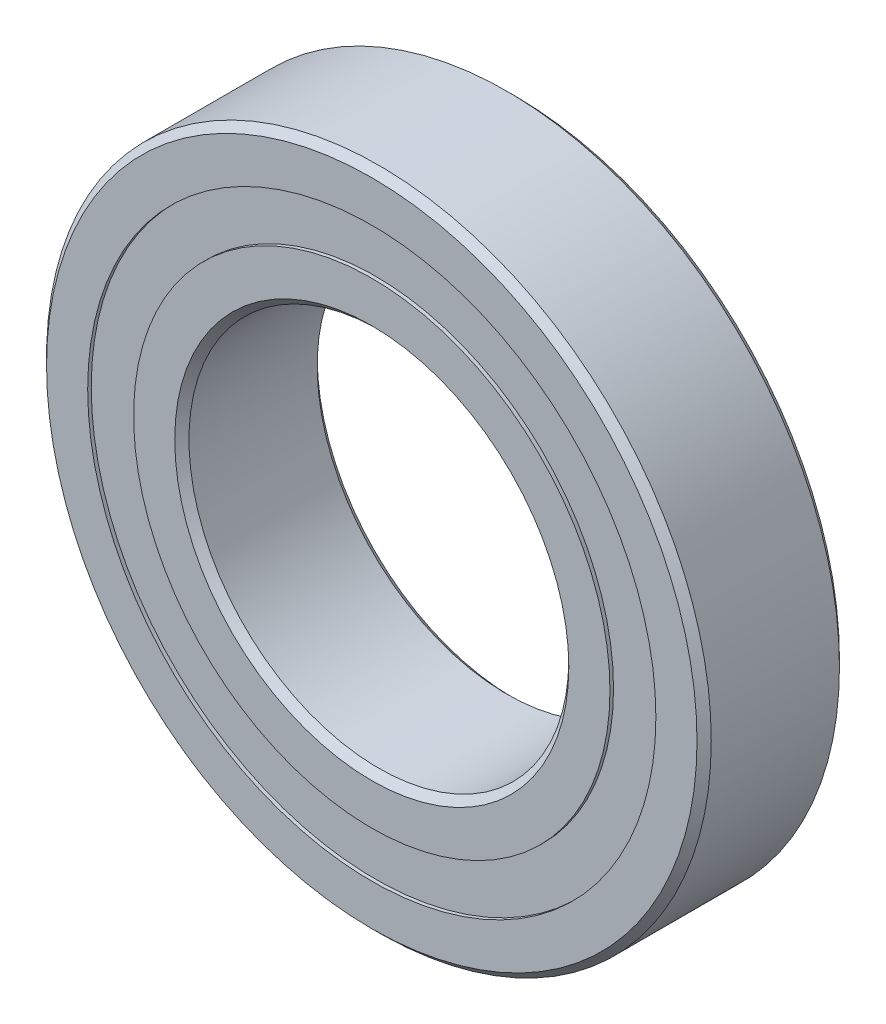
ISO-10303-21;
HEADER;
FILE_DESCRIPTION(('STEP AP214'),'2;1');
FILE_NAME('part.step','',(''),(''),'','','');
FILE_SCHEMA(('AUTOMOTIVE_DESIGN { 1 0 10303 214 1 1 1 1 }'));
ENDSEC;
DATA;
#1=APPLICATION_CONTEXT('core data for automotive mechanical design processes');
#2=APPLICATION_PROTOCOL_DEFINITION('international standard','automotive_design',2000,#1);
#3=PRODUCT_CONTEXT('',#1,'mechanical');
#4=PRODUCT('Part','Part','',(#3));
#5=PRODUCT_RELATED_PRODUCT_CATEGORY('part','',(#4));
#6=PRODUCT_DEFINITION_FORMATION('','',#4);
#7=PRODUCT_DEFINITION_CONTEXT('part definition',#1,'design');
#8=PRODUCT_DEFINITION('design','',#6,#7);
#9=PRODUCT_DEFINITION_SHAPE('','',#8);
#10=(LENGTH_UNIT() NAMED_UNIT(*) SI_UNIT(.MILLI.,.METRE.));
#11=(NAMED_UNIT(*) PLANE_ANGLE_UNIT() SI_UNIT($,.RADIAN.));
#12=(NAMED_UNIT(*) SI_UNIT($,.STERADIAN.) SOLID_ANGLE_UNIT());
#13=UNCERTAINTY_MEASURE_WITH_UNIT(LENGTH_MEASURE(1.E-05),#10,'distance_accuracy_value','');
#14=(GEOMETRIC_REPRESENTATION_CONTEXT(3) GLOBAL_UNCERTAINTY_ASSIGNED_CONTEXT((#13)) GLOBAL_UNIT_ASSIGNED_CONTEXT((#10,
#11,#12)) REPRESENTATION_CONTEXT('',''));
#15=CARTESIAN_POINT('',(0.,0.,0.));
#16=DIRECTION('',(0.,0.,1.));
#17=DIRECTION('',(1.,0.,0.));
#18=AXIS2_PLACEMENT_3D('',#15,#16,#17);
#19=CARTESIAN_POINT('',(0.,28.4964972527473,-6.7865625));
#20=DIRECTION('',(0.,0.,1.));
#21=DIRECTION('',(1.,0.,0.));
#22=AXIS2_PLACEMENT_3D('',#19,#20,#21);
#23=PLANE('',#22);
#24=CARTESIAN_POINT('',(0.,0.,-6.7865625));
#25=DIRECTION('',(0.,0.,1.));
#26=DIRECTION('',(1.,0.,0.));
#27=AXIS2_PLACEMENT_3D('',#24,#25,#26);
#28=CIRCLE('',#27,28.4964972527473);
#29=CARTESIAN_POINT('',(28.4964972527473,0.,-6.7865625));
#30=VERTEX_POINT('',#29);
#31=EDGE_CURVE('E61',#30,#30,#28,.T.);
#32=ORIENTED_EDGE('',*,*,#31,.F.);
#33=EDGE_LOOP('',(#32));
#34=FACE_BOUND('',#33,.T.);
#35=CARTESIAN_POINT('',(0.,0.,-6.7865625));
#36=DIRECTION('',(0.,0.,1.));
#37=DIRECTION('',(1.,0.,0.));
#38=AXIS2_PLACEMENT_3D('',#35,#36,#37);
#39=CIRCLE('',#38,23.8910027472527);
#40=CARTESIAN_POINT('',(23.8910027472527,0.,-6.7865625));
#41=VERTEX_POINT('',#40);
#42=EDGE_CURVE('E11',#41,#41,#39,.T.);
#43=ORIENTED_EDGE('',*,*,#42,.T.);
#44=EDGE_LOOP('',(#43));
#45=FACE_BOUND('',#44,.T.);
#46=ADVANCED_FACE('F47',(#34,#45),#23,.F.);
#47=CARTESIAN_POINT('',(0.,0.,7.14375));
#48=DIRECTION('',(0.,0.,1.));
#49=DIRECTION('',(1.,0.,0.));
#50=AXIS2_PLACEMENT_3D('',#47,#48,#49);
#51=CYLINDRICAL_SURFACE('',#50,23.8910027472527);
#52=ORIENTED_EDGE('',*,*,#42,.F.);
#53=EDGE_LOOP('',(#52));
#54=FACE_BOUND('',#53,.T.);
#55=CARTESIAN_POINT('',(0.,0.,-3.92215118398501));
#56=DIRECTION('',(0.,0.,1.));
#57=DIRECTION('',(1.,0.,0.));
#58=AXIS2_PLACEMENT_3D('',#55,#56,#57);
#59=CIRCLE('',#58,23.8910027472527);
#60=CARTESIAN_POINT('',(23.8910027472527,0.,-3.92215118398501));
#61=VERTEX_POINT('',#60);
#62=EDGE_CURVE('E53',#61,#61,#59,.T.);
#63=ORIENTED_EDGE('',*,*,#62,.T.);
#64=EDGE_LOOP('',(#63));
#65=FACE_BOUND('',#64,.T.);
#66=ADVANCED_FACE('F70',(#54,#65),#51,.F.);
#67=CARTESIAN_POINT('',(0.,28.4964972527473,-3.92215118398501));
#68=DIRECTION('',(0.,0.,-1.));
#69=DIRECTION('',(-1.,0.,0.));
#70=AXIS2_PLACEMENT_3D('',#67,#68,#69);
#71=PLANE('',#70);
#72=ORIENTED_EDGE('',*,*,#62,.F.);
#73=EDGE_LOOP('',(#72));
#74=FACE_BOUND('',#73,.T.);
#75=CARTESIAN_POINT('',(0.,0.,-3.92215118398501));
#76=DIRECTION('',(0.,0.,1.));
#77=DIRECTION('',(1.,0.,0.));
#78=AXIS2_PLACEMENT_3D('',#75,#76,#77);
#79=CIRCLE('',#78,28.4964972527473);
#80=CARTESIAN_POINT('',(28.4964972527473,0.,-3.92215118398501));
#81=VERTEX_POINT('',#80);
#82=EDGE_CURVE('E57',#81,#81,#79,.T.);
#83=ORIENTED_EDGE('',*,*,#82,.T.);
#84=EDGE_LOOP('',(#83));
#85=FACE_BOUND('',#84,.T.);
#86=ADVANCED_FACE('F74',(#74,#85),#71,.F.);
#87=CARTESIAN_POINT('',(0.,0.,7.14375));
#88=DIRECTION('',(0.,0.,1.));
#89=DIRECTION('',(1.,0.,0.));
#90=AXIS2_PLACEMENT_3D('',#87,#88,#89);
#91=CYLINDRICAL_SURFACE('',#90,28.4964972527473);
#92=ORIENTED_EDGE('',*,*,#82,.F.);
#93=EDGE_LOOP('',(#92));
#94=FACE_BOUND('',#93,.T.);
#95=ORIENTED_EDGE('',*,*,#31,.T.);
#96=EDGE_LOOP('',(#95));
#97=FACE_BOUND('',#96,.T.);
#98=ADVANCED_FACE('F67',(#94,#97),#91,.T.);
#99=CLOSED_SHELL('',(#46,#66,#86,#98));
#100=MANIFOLD_SOLID_BREP('B2',#99);
#101=CARTESIAN_POINT('',(0.,28.4964972527473,6.7865625));
#102=DIRECTION('',(0.,0.,-1.));
#103=DIRECTION('',(-1.,0.,0.));
#104=AXIS2_PLACEMENT_3D('',#101,#102,#103);
#105=PLANE('',#104);
#106=CARTESIAN_POINT('',(0.,0.,6.7865625));
#107=DIRECTION('',(0.,0.,1.));
#108=DIRECTION('',(1.,0.,0.));
#109=AXIS2_PLACEMENT_3D('',#106,#107,#108);
#110=CIRCLE('',#109,23.8910027472527);
#111=CARTESIAN_POINT('',(23.8910027472527,0.,6.7865625));
#112=VERTEX_POINT('',#111);
#113=EDGE_CURVE('E46',#112,#112,#110,.T.);
#114=ORIENTED_EDGE('',*,*,#113,.F.);
#115=EDGE_LOOP('',(#114));
#116=FACE_BOUND('',#115,.T.);
#117=CARTESIAN_POINT('',(0.,0.,6.7865625));
#118=DIRECTION('',(0.,0.,1.));
#119=DIRECTION('',(1.,0.,0.));
#120=AXIS2_PLACEMENT_3D('',#117,#118,#119);
#121=CIRCLE('',#120,28.4964972527473);
#122=CARTESIAN_POINT('',(28.4964972527473,0.,6.7865625));
#123=VERTEX_POINT('',#122);
#124=EDGE_CURVE('E128',#123,#123,#121,.T.);
#125=ORIENTED_EDGE('',*,*,#124,.T.);
#126=EDGE_LOOP('',(#125));
#127=FACE_BOUND('',#126,.T.);
#128=ADVANCED_FACE('F114',(#116,#127),#105,.F.);
#129=CARTESIAN_POINT('',(0.,0.,7.14375));
#130=DIRECTION('',(0.,0.,1.));
#131=DIRECTION('',(1.,0.,0.));
#132=AXIS2_PLACEMENT_3D('',#129,#130,#131);
#133=CYLINDRICAL_SURFACE('',#132,23.8910027472527);
#134=CARTESIAN_POINT('',(0.,0.,3.92215118398501));
#135=DIRECTION('',(0.,0.,1.));
#136=DIRECTION('',(1.,0.,0.));
#137=AXIS2_PLACEMENT_3D('',#134,#135,#136);
#138=CIRCLE('',#137,23.8910027472527);
#139=CARTESIAN_POINT('',(23.8910027472527,0.,3.92215118398501));
#140=VERTEX_POINT('',#139);
#141=EDGE_CURVE('E120',#140,#140,#138,.T.);
#142=ORIENTED_EDGE('',*,*,#141,.F.);
#143=EDGE_LOOP('',(#142));
#144=FACE_BOUND('',#143,.T.);
#145=ORIENTED_EDGE('',*,*,#113,.T.);
#146=EDGE_LOOP('',(#145));
#147=FACE_BOUND('',#146,.T.);
#148=ADVANCED_FACE('F143',(#144,#147),#133,.F.);
#149=CARTESIAN_POINT('',(0.,28.4964972527473,3.92215118398501));
#150=DIRECTION('',(0.,0.,1.));
#151=DIRECTION('',(1.,0.,0.));
#152=AXIS2_PLACEMENT_3D('',#149,#150,#151);
#153=PLANE('',#152);
#154=CARTESIAN_POINT('',(0.,0.,3.92215118398501));
#155=DIRECTION('',(0.,0.,1.));
#156=DIRECTION('',(1.,0.,0.));
#157=AXIS2_PLACEMENT_3D('',#154,#155,#156);
#158=CIRCLE('',#157,28.4964972527473);
#159=CARTESIAN_POINT('',(28.4964972527473,0.,3.92215118398501));
#160=VERTEX_POINT('',#159);
#161=EDGE_CURVE('E124',#160,#160,#158,.T.);
#162=ORIENTED_EDGE('',*,*,#161,.F.);
#163=EDGE_LOOP('',(#162));
#164=FACE_BOUND('',#163,.T.);
#165=ORIENTED_EDGE('',*,*,#141,.T.);
#166=EDGE_LOOP('',(#165));
#167=FACE_BOUND('',#166,.T.);
#168=ADVANCED_FACE('F138',(#164,#167),#153,.F.);
#169=CARTESIAN_POINT('',(0.,0.,7.14375));
#170=DIRECTION('',(0.,0.,1.));
#171=DIRECTION('',(1.,0.,0.));
#172=AXIS2_PLACEMENT_3D('',#169,#170,#171);
#173=CYLINDRICAL_SURFACE('',#172,28.4964972527473);
#174=ORIENTED_EDGE('',*,*,#124,.F.);
#175=EDGE_LOOP('',(#174));
#176=FACE_BOUND('',#175,.T.);
#177=ORIENTED_EDGE('',*,*,#161,.T.);
#178=EDGE_LOOP('',(#177));
#179=FACE_BOUND('',#178,.T.);
#180=ADVANCED_FACE('F135',(#176,#179),#173,.T.);
#181=CLOSED_SHELL('',(#128,#148,#168,#180));
#182=MANIFOLD_SOLID_BREP('B6',#181);
#183=CARTESIAN_POINT('',(-13.0968749999997,22.6844529203788,0.));
#184=DIRECTION('',(0.,0.,1.));
#185=DIRECTION('',(-0.499999999999989,0.866025403784445,0.));
#186=AXIS2_PLACEMENT_3D('',#183,#184,#185);
#187=SPHERICAL_SURFACE('',#186,3.92215118398501);
#188=CARTESIAN_POINT('',(-13.0968749999997,22.6844529203788,3.92215118398501));
#189=VERTEX_POINT('',#188);
#190=VERTEX_LOOP('',#189);
#191=FACE_BOUND('',#190,.T.);
#192=ADVANCED_FACE('F181',(#191),#187,.T.);
#193=CLOSED_SHELL('',(#192));
#194=MANIFOLD_SOLID_BREP('B41',#193);
#195=CARTESIAN_POINT('',(-22.6844529203785,13.0968750000003,0.));
#196=DIRECTION('',(0.,0.,1.));
#197=DIRECTION('',(-0.866025403784433,0.50000000000001,0.));
#198=AXIS2_PLACEMENT_3D('',#195,#196,#197);
#199=SPHERICAL_SURFACE('',#198,3.92215118398501);
#200=CARTESIAN_POINT('',(-22.6844529203785,13.0968750000003,3.92215118398501));
#201=VERTEX_POINT('',#200);
#202=VERTEX_LOOP('',#201);
#203=FACE_BOUND('',#202,.T.);
#204=ADVANCED_FACE('F201',(#203),#199,.T.);
#205=CLOSED_SHELL('',(#204));
#206=MANIFOLD_SOLID_BREP('B110',#205);
#207=CARTESIAN_POINT('',(-26.19375,2.74364967957967E-13,0.));
#208=DIRECTION('',(0.,0.,1.));
#209=DIRECTION('',(-1.,0.,0.));
#210=AXIS2_PLACEMENT_3D('',#207,#208,#209);
#211=SPHERICAL_SURFACE('',#210,3.92215118398501);
#212=CARTESIAN_POINT('',(-26.19375,2.74364967957967E-13,3.92215118398501));
#213=VERTEX_POINT('',#212);
#214=VERTEX_LOOP('',#213);
#215=FACE_BOUND('',#214,.T.);
#216=ADVANCED_FACE('F221',(#215),#211,.T.);
#217=CLOSED_SHELL('',(#216));
#218=MANIFOLD_SOLID_BREP('B177',#217);
#219=CARTESIAN_POINT('',(-22.6844529203788,-13.0968749999998,0.));
#220=DIRECTION('',(0.,0.,1.));
#221=DIRECTION('',(-0.866025403784443,-0.499999999999992,0.));
#222=AXIS2_PLACEMENT_3D('',#219,#220,#221);
#223=SPHERICAL_SURFACE('',#222,3.92215118398501);
#224=CARTESIAN_POINT('',(-22.6844529203788,-13.0968749999998,3.92215118398501));
#225=VERTEX_POINT('',#224);
#226=VERTEX_LOOP('',#225);
#227=FACE_BOUND('',#226,.T.);
#228=ADVANCED_FACE('F241',(#227),#223,.T.);
#229=CLOSED_SHELL('',(#228));
#230=MANIFOLD_SOLID_BREP('B197',#229);
#231=CARTESIAN_POINT('',(-13.0968750000002,-22.6844529203785,0.));
#232=DIRECTION('',(0.,0.,1.));
#233=DIRECTION('',(-0.500000000000007,-0.866025403784435,0.));
#234=AXIS2_PLACEMENT_3D('',#231,#232,#233);
#235=SPHERICAL_SURFACE('',#234,3.92215118398501);
#236=CARTESIAN_POINT('',(-13.0968750000002,-22.6844529203785,3.92215118398501));
#237=VERTEX_POINT('',#236);
#238=VERTEX_LOOP('',#237);
#239=FACE_BOUND('',#238,.T.);
#240=ADVANCED_FACE('F261',(#239),#235,.T.);
#241=CLOSED_SHELL('',(#240));
#242=MANIFOLD_SOLID_BREP('B217',#241);
#243=CARTESIAN_POINT('',(-1.82909978638645E-13,-26.19375,0.));
#244=DIRECTION('',(0.,0.,1.));
#245=DIRECTION('',(0.,-1.,0.));
#246=AXIS2_PLACEMENT_3D('',#243,#244,#245);
#247=SPHERICAL_SURFACE('',#246,3.92215118398501);
#248=CARTESIAN_POINT('',(-1.82909978638645E-13,-26.19375,3.92215118398501));
#249=VERTEX_POINT('',#248);
#250=VERTEX_LOOP('',#249);
#251=FACE_BOUND('',#250,.T.);
#252=ADVANCED_FACE('F281',(#251),#247,.T.);
#253=CLOSED_SHELL('',(#252));
#254=MANIFOLD_SOLID_BREP('B237',#253);
#255=CARTESIAN_POINT('',(13.0968749999999,-22.6844529203787,0.));
#256=DIRECTION('',(0.,0.,1.));
#257=DIRECTION('',(0.499999999999995,-0.866025403784442,0.));
#258=AXIS2_PLACEMENT_3D('',#255,#256,#257);
#259=SPHERICAL_SURFACE('',#258,3.92215118398501);
#260=CARTESIAN_POINT('',(13.0968749999999,-22.6844529203787,3.92215118398501));
#261=VERTEX_POINT('',#260);
#262=VERTEX_LOOP('',#261);
#263=FACE_BOUND('',#262,.T.);
#264=ADVANCED_FACE('F301',(#263),#259,.T.);
#265=CLOSED_SHELL('',(#264));
#266=MANIFOLD_SOLID_BREP('B257',#265);
#267=CARTESIAN_POINT('',(22.6844529203786,-13.0968750000001,0.));
#268=DIRECTION('',(0.,0.,1.));
#269=DIRECTION('',(0.866025403784436,-0.500000000000004,0.));
#270=AXIS2_PLACEMENT_3D('',#267,#268,#269);
#271=SPHERICAL_SURFACE('',#270,3.92215118398501);
#272=CARTESIAN_POINT('',(22.6844529203786,-13.0968750000001,3.92215118398501));
#273=VERTEX_POINT('',#272);
#274=VERTEX_LOOP('',#273);
#275=FACE_BOUND('',#274,.T.);
#276=ADVANCED_FACE('F321',(#275),#271,.T.);
#277=CLOSED_SHELL('',(#276));
#278=MANIFOLD_SOLID_BREP('B277',#277);
#279=CARTESIAN_POINT('',(26.19375,0.,0.));
#280=DIRECTION('',(0.,0.,1.));
#281=DIRECTION('',(1.,0.,0.));
#282=AXIS2_PLACEMENT_3D('',#279,#280,#281);
#283=SPHERICAL_SURFACE('',#282,3.92215118398501);
#284=CARTESIAN_POINT('',(26.19375,0.,3.92215118398501));
#285=VERTEX_POINT('',#284);
#286=VERTEX_LOOP('',#285);
#287=FACE_BOUND('',#286,.T.);
#288=ADVANCED_FACE('F341',(#287),#283,.T.);
#289=CLOSED_SHELL('',(#288));
#290=MANIFOLD_SOLID_BREP('B297',#289);
#291=CARTESIAN_POINT('',(22.6844529203787,13.0968749999999,0.));
#292=DIRECTION('',(0.,0.,1.));
#293=DIRECTION('',(0.86602540378444,0.499999999999998,0.));
#294=AXIS2_PLACEMENT_3D('',#291,#292,#293);
#295=SPHERICAL_SURFACE('',#294,3.92215118398501);
#296=CARTESIAN_POINT('',(22.6844529203787,13.0968749999999,3.92215118398501));
#297=VERTEX_POINT('',#296);
#298=VERTEX_LOOP('',#297);
#299=FACE_BOUND('',#298,.T.);
#300=ADVANCED_FACE('F361',(#299),#295,.T.);
#301=CLOSED_SHELL('',(#300));
#302=MANIFOLD_SOLID_BREP('B317',#301);
#303=CARTESIAN_POINT('',(13.096875,22.6844529203786,0.));
#304=DIRECTION('',(0.,0.,1.));
#305=DIRECTION('',(0.500000000000001,0.866025403784438,0.));
#306=AXIS2_PLACEMENT_3D('',#303,#304,#305);
#307=SPHERICAL_SURFACE('',#306,3.92215118398501);
#308=CARTESIAN_POINT('',(13.096875,22.6844529203786,3.92215118398501));
#309=VERTEX_POINT('',#308);
#310=VERTEX_LOOP('',#309);
#311=FACE_BOUND('',#310,.T.);
#312=ADVANCED_FACE('F381',(#311),#307,.T.);
#313=CLOSED_SHELL('',(#312));
#314=MANIFOLD_SOLID_BREP('B337',#313);
#315=CARTESIAN_POINT('',(0.,26.19375,0.));
#316=DIRECTION('',(0.,0.,1.));
#317=DIRECTION('',(0.,1.,0.));
#318=AXIS2_PLACEMENT_3D('',#315,#316,#317);
#319=SPHERICAL_SURFACE('',#318,3.92215118398501);
#320=CARTESIAN_POINT('',(0.,26.19375,3.92215118398501));
#321=VERTEX_POINT('',#320);
#322=VERTEX_LOOP('',#321);
#323=FACE_BOUND('',#322,.T.);
#324=ADVANCED_FACE('F403',(#323),#319,.T.);
#325=CLOSED_SHELL('',(#324));
#326=MANIFOLD_SOLID_BREP('B357',#325);
#327=CARTESIAN_POINT('',(0.,23.8910027472527,7.14375));
#328=DIRECTION('',(0.,0.,-1.));
#329=DIRECTION('',(-1.,0.,0.));
#330=AXIS2_PLACEMENT_3D('',#327,#328,#329);
#331=PLANE('',#330);
#332=CARTESIAN_POINT('',(0.,0.,7.14375));
#333=DIRECTION('',(0.,0.,1.));
#334=DIRECTION('',(1.,0.,0.));
#335=AXIS2_PLACEMENT_3D('',#332,#333,#334);
#336=CIRCLE('',#335,19.764375);
#337=CARTESIAN_POINT('',(19.764375,0.,7.14375));
#338=VERTEX_POINT('',#337);
#339=EDGE_CURVE('E450',#338,#338,#336,.T.);
#340=ORIENTED_EDGE('',*,*,#339,.F.);
#341=EDGE_LOOP('',(#340));
#342=FACE_BOUND('',#341,.T.);
#343=CARTESIAN_POINT('',(0.,0.,7.14375));
#344=DIRECTION('',(0.,0.,1.));
#345=DIRECTION('',(1.,0.,0.));
#346=AXIS2_PLACEMENT_3D('',#343,#344,#345);
#347=CIRCLE('',#346,23.8910027472527);
#348=CARTESIAN_POINT('',(23.8910027472527,0.,7.14375));
#349=VERTEX_POINT('',#348);
#350=EDGE_CURVE('E402',#349,#349,#347,.T.);
#351=ORIENTED_EDGE('',*,*,#350,.T.);
#352=EDGE_LOOP('',(#351));
#353=FACE_BOUND('',#352,.T.);
#354=ADVANCED_FACE('F422',(#342,#353),#331,.F.);
#355=CARTESIAN_POINT('',(0.,0.,7.14375));
#356=DIRECTION('',(0.,0.,1.));
#357=DIRECTION('',(1.,0.,0.));
#358=AXIS2_PLACEMENT_3D('',#355,#356,#357);
#359=CYLINDRICAL_SURFACE('',#358,23.8910027472527);
#360=ORIENTED_EDGE('',*,*,#350,.F.);
#361=EDGE_LOOP('',(#360));
#362=FACE_BOUND('',#361,.T.);
#363=CARTESIAN_POINT('',(0.,0.,3.175));
#364=DIRECTION('',(0.,0.,1.));
#365=DIRECTION('',(1.,0.,0.));
#366=AXIS2_PLACEMENT_3D('',#363,#364,#365);
#367=CIRCLE('',#366,23.8910027472527);
#368=CARTESIAN_POINT('',(23.8910027472527,0.,3.175));
#369=VERTEX_POINT('',#368);
#370=EDGE_CURVE('E428',#369,#369,#367,.T.);
#371=ORIENTED_EDGE('',*,*,#370,.T.);
#372=EDGE_LOOP('',(#371));
#373=FACE_BOUND('',#372,.T.);
#374=ADVANCED_FACE('F457',(#362,#373),#359,.T.);
#375=CARTESIAN_POINT('',(0.,0.,0.));
#376=DIRECTION('',(0.,0.,1.));
#377=DIRECTION('',(1.,0.,0.));
#378=AXIS2_PLACEMENT_3D('',#375,#376,#377);
#379=TOROIDAL_SURFACE('',#378,26.19375,3.922151183985);
#380=ORIENTED_EDGE('',*,*,#370,.F.);
#381=EDGE_LOOP('',(#380));
#382=FACE_BOUND('',#381,.T.);
#383=CARTESIAN_POINT('',(0.,0.,-3.17500000000001));
#384=DIRECTION('',(0.,0.,1.));
#385=DIRECTION('',(1.,0.,0.));
#386=AXIS2_PLACEMENT_3D('',#383,#384,#385);
#387=CIRCLE('',#386,23.8910027472527);
#388=CARTESIAN_POINT('',(23.8910027472527,0.,-3.17500000000001));
#389=VERTEX_POINT('',#388);
#390=EDGE_CURVE('E432',#389,#389,#387,.T.);
#391=ORIENTED_EDGE('',*,*,#390,.T.);
#392=EDGE_LOOP('',(#391));
#393=FACE_BOUND('',#392,.T.);
#394=ADVANCED_FACE('F461',(#382,#393),#379,.F.);
#395=CARTESIAN_POINT('',(0.,0.,7.14375));
#396=DIRECTION('',(0.,0.,1.));
#397=DIRECTION('',(1.,0.,0.));
#398=AXIS2_PLACEMENT_3D('',#395,#396,#397);
#399=CYLINDRICAL_SURFACE('',#398,23.8910027472527);
#400=ORIENTED_EDGE('',*,*,#390,.F.);
#401=EDGE_LOOP('',(#400));
#402=FACE_BOUND('',#401,.T.);
#403=CARTESIAN_POINT('',(0.,0.,-7.14375));
#404=DIRECTION('',(0.,0.,1.));
#405=DIRECTION('',(1.,0.,0.));
#406=AXIS2_PLACEMENT_3D('',#403,#404,#405);
#407=CIRCLE('',#406,23.8910027472527);
#408=CARTESIAN_POINT('',(23.8910027472527,0.,-7.14375));
#409=VERTEX_POINT('',#408);
#410=EDGE_CURVE('E436',#409,#409,#407,.T.);
#411=ORIENTED_EDGE('',*,*,#410,.T.);
#412=EDGE_LOOP('',(#411));
#413=FACE_BOUND('',#412,.T.);
#414=ADVANCED_FACE('F466',(#402,#413),#399,.T.);
#415=CARTESIAN_POINT('',(0.,19.764375,-7.14375));
#416=DIRECTION('',(0.,0.,1.));
#417=DIRECTION('',(1.,0.,0.));
#418=AXIS2_PLACEMENT_3D('',#415,#416,#417);
#419=PLANE('',#418);
#420=ORIENTED_EDGE('',*,*,#410,.F.);
#421=EDGE_LOOP('',(#420));
#422=FACE_BOUND('',#421,.T.);
#423=CARTESIAN_POINT('',(0.,0.,-7.14375));
#424=DIRECTION('',(0.,0.,1.));
#425=DIRECTION('',(1.,0.,0.));
#426=AXIS2_PLACEMENT_3D('',#423,#424,#425);
#427=CIRCLE('',#426,19.764375);
#428=CARTESIAN_POINT('',(19.764375,0.,-7.14375));
#429=VERTEX_POINT('',#428);
#430=EDGE_CURVE('E441',#429,#429,#427,.T.);
#431=ORIENTED_EDGE('',*,*,#430,.T.);
#432=EDGE_LOOP('',(#431));
#433=FACE_BOUND('',#432,.T.);
#434=ADVANCED_FACE('F472',(#422,#433),#419,.F.);
#435=CARTESIAN_POINT('',(0.,0.,-6.429375));
#436=DIRECTION('',(0.,0.,-1.));
#437=DIRECTION('',(-1.,0.,0.));
#438=AXIS2_PLACEMENT_3D('',#435,#436,#437);
#439=CONICAL_SURFACE('',#438,19.05,0.785398163397446);
#440=ORIENTED_EDGE('',*,*,#430,.F.);
#441=EDGE_LOOP('',(#440));
#442=FACE_BOUND('',#441,.T.);
#443=CARTESIAN_POINT('',(0.,0.,-6.429375));
#444=DIRECTION('',(0.,0.,1.));
#445=DIRECTION('',(1.,0.,0.));
#446=AXIS2_PLACEMENT_3D('',#443,#444,#445);
#447=CIRCLE('',#446,19.05);
#448=CARTESIAN_POINT('',(19.05,0.,-6.429375));
#449=VERTEX_POINT('',#448);
#450=EDGE_CURVE('E444',#449,#449,#447,.T.);
#451=ORIENTED_EDGE('',*,*,#450,.T.);
#452=EDGE_LOOP('',(#451));
#453=FACE_BOUND('',#452,.T.);
#454=ADVANCED_FACE('F476',(#442,#453),#439,.F.);
#455=CARTESIAN_POINT('',(0.,0.,7.14375));
#456=DIRECTION('',(0.,0.,1.));
#457=DIRECTION('',(1.,0.,0.));
#458=AXIS2_PLACEMENT_3D('',#455,#456,#457);
#459=CYLINDRICAL_SURFACE('',#458,19.05);
#460=ORIENTED_EDGE('',*,*,#450,.F.);
#461=EDGE_LOOP('',(#460));
#462=FACE_BOUND('',#461,.T.);
#463=CARTESIAN_POINT('',(0.,0.,6.429375));
#464=DIRECTION('',(0.,0.,1.));
#465=DIRECTION('',(1.,0.,0.));
#466=AXIS2_PLACEMENT_3D('',#463,#464,#465);
#467=CIRCLE('',#466,19.05);
#468=CARTESIAN_POINT('',(19.05,0.,6.429375));
#469=VERTEX_POINT('',#468);
#470=EDGE_CURVE('E447',#469,#469,#467,.T.);
#471=ORIENTED_EDGE('',*,*,#470,.T.);
#472=EDGE_LOOP('',(#471));
#473=FACE_BOUND('',#472,.T.);
#474=ADVANCED_FACE('F480',(#462,#473),#459,.F.);
#475=CARTESIAN_POINT('',(0.,0.,7.14375));
#476=DIRECTION('',(0.,0.,1.));
#477=DIRECTION('',(1.,0.,0.));
#478=AXIS2_PLACEMENT_3D('',#475,#476,#477);
#479=CONICAL_SURFACE('',#478,19.764375,0.785398163397447);
#480=ORIENTED_EDGE('',*,*,#470,.F.);
#481=EDGE_LOOP('',(#480));
#482=FACE_BOUND('',#481,.T.);
#483=ORIENTED_EDGE('',*,*,#339,.T.);
#484=EDGE_LOOP('',(#483));
#485=FACE_BOUND('',#484,.T.);
#486=ADVANCED_FACE('F454',(#482,#485),#479,.F.);
#487=CLOSED_SHELL('',(#354,#374,#394,#414,#434,#454,#474,#486));
#488=MANIFOLD_SOLID_BREP('B377',#487);
#489=CARTESIAN_POINT('',(0.,0.,6.429375));
#490=DIRECTION('',(0.,0.,-1.));
#491=DIRECTION('',(-1.,0.,0.));
#492=AXIS2_PLACEMENT_3D('',#489,#490,#491);
#493=CONICAL_SURFACE('',#492,33.3375,0.785398163397446);
#494=CARTESIAN_POINT('',(0.,0.,7.14375));
#495=DIRECTION('',(0.,0.,1.));
#496=DIRECTION('',(1.,0.,0.));
#497=AXIS2_PLACEMENT_3D('',#494,#495,#496);
#498=CIRCLE('',#497,32.623125);
#499=CARTESIAN_POINT('',(32.623125,0.,7.14375));
#500=VERTEX_POINT('',#499);
#501=EDGE_CURVE('E571',#500,#500,#498,.T.);
#502=ORIENTED_EDGE('',*,*,#501,.F.);
#503=EDGE_LOOP('',(#502));
#504=FACE_BOUND('',#503,.T.);
#505=CARTESIAN_POINT('',(0.,0.,6.429375));
#506=DIRECTION('',(0.,0.,1.));
#507=DIRECTION('',(1.,0.,0.));
#508=AXIS2_PLACEMENT_3D('',#505,#506,#507);
#509=CIRCLE('',#508,33.3375);
#510=CARTESIAN_POINT('',(33.3375,0.,6.429375));
#511=VERTEX_POINT('',#510);
#512=EDGE_CURVE('E421',#511,#511,#509,.T.);
#513=ORIENTED_EDGE('',*,*,#512,.T.);
#514=EDGE_LOOP('',(#513));
#515=FACE_BOUND('',#514,.T.);
#516=ADVANCED_FACE('F543',(#504,#515),#493,.T.);
#517=CARTESIAN_POINT('',(0.,0.,7.14375));
#518=DIRECTION('',(0.,0.,1.));
#519=DIRECTION('',(1.,0.,0.));
#520=AXIS2_PLACEMENT_3D('',#517,#518,#519);
#521=CYLINDRICAL_SURFACE('',#520,33.3375);
#522=ORIENTED_EDGE('',*,*,#512,.F.);
#523=EDGE_LOOP('',(#522));
#524=FACE_BOUND('',#523,.T.);
#525=CARTESIAN_POINT('',(0.,0.,-6.429375));
#526=DIRECTION('',(0.,0.,1.));
#527=DIRECTION('',(1.,0.,0.));
#528=AXIS2_PLACEMENT_3D('',#525,#526,#527);
#529=CIRCLE('',#528,33.3375);
#530=CARTESIAN_POINT('',(33.3375,0.,-6.429375));
#531=VERTEX_POINT('',#530);
#532=EDGE_CURVE('E549',#531,#531,#529,.T.);
#533=ORIENTED_EDGE('',*,*,#532,.T.);
#534=EDGE_LOOP('',(#533));
#535=FACE_BOUND('',#534,.T.);
#536=ADVANCED_FACE('F578',(#524,#535),#521,.T.);
#537=CARTESIAN_POINT('',(0.,0.,-7.14375));
#538=DIRECTION('',(0.,0.,1.));
#539=DIRECTION('',(1.,0.,0.));
#540=AXIS2_PLACEMENT_3D('',#537,#538,#539);
#541=CONICAL_SURFACE('',#540,32.623125,0.785398163397446);
#542=ORIENTED_EDGE('',*,*,#532,.F.);
#543=EDGE_LOOP('',(#542));
#544=FACE_BOUND('',#543,.T.);
#545=CARTESIAN_POINT('',(0.,0.,-7.14375));
#546=DIRECTION('',(0.,0.,1.));
#547=DIRECTION('',(1.,0.,0.));
#548=AXIS2_PLACEMENT_3D('',#545,#546,#547);
#549=CIRCLE('',#548,32.623125);
#550=CARTESIAN_POINT('',(32.623125,0.,-7.14375));
#551=VERTEX_POINT('',#550);
#552=EDGE_CURVE('E553',#551,#551,#549,.T.);
#553=ORIENTED_EDGE('',*,*,#552,.T.);
#554=EDGE_LOOP('',(#553));
#555=FACE_BOUND('',#554,.T.);
#556=ADVANCED_FACE('F582',(#544,#555),#541,.T.);
#557=CARTESIAN_POINT('',(0.,32.623125,-7.14375));
#558=DIRECTION('',(0.,0.,1.));
#559=DIRECTION('',(1.,0.,0.));
#560=AXIS2_PLACEMENT_3D('',#557,#558,#559);
#561=PLANE('',#560);
#562=ORIENTED_EDGE('',*,*,#552,.F.);
#563=EDGE_LOOP('',(#562));
#564=FACE_BOUND('',#563,.T.);
#565=CARTESIAN_POINT('',(0.,0.,-7.14375));
#566=DIRECTION('',(0.,0.,1.));
#567=DIRECTION('',(1.,0.,0.));
#568=AXIS2_PLACEMENT_3D('',#565,#566,#567);
#569=CIRCLE('',#568,28.4964972527473);
#570=CARTESIAN_POINT('',(28.4964972527473,0.,-7.14375));
#571=VERTEX_POINT('',#570);
#572=EDGE_CURVE('E557',#571,#571,#569,.T.);
#573=ORIENTED_EDGE('',*,*,#572,.T.);
#574=EDGE_LOOP('',(#573));
#575=FACE_BOUND('',#574,.T.);
#576=ADVANCED_FACE('F587',(#564,#575),#561,.F.);
#577=CARTESIAN_POINT('',(0.,0.,7.14375));
#578=DIRECTION('',(0.,0.,1.));
#579=DIRECTION('',(1.,0.,0.));
#580=AXIS2_PLACEMENT_3D('',#577,#578,#579);
#581=CYLINDRICAL_SURFACE('',#580,28.4964972527473);
#582=ORIENTED_EDGE('',*,*,#572,.F.);
#583=EDGE_LOOP('',(#582));
#584=FACE_BOUND('',#583,.T.);
#585=CARTESIAN_POINT('',(0.,0.,-3.175));
#586=DIRECTION('',(0.,0.,1.));
#587=DIRECTION('',(1.,0.,0.));
#588=AXIS2_PLACEMENT_3D('',#585,#586,#587);
#589=CIRCLE('',#588,28.4964972527473);
#590=CARTESIAN_POINT('',(28.4964972527473,0.,-3.175));
#591=VERTEX_POINT('',#590);
#592=EDGE_CURVE('E562',#591,#591,#589,.T.);
#593=ORIENTED_EDGE('',*,*,#592,.T.);
#594=EDGE_LOOP('',(#593));
#595=FACE_BOUND('',#594,.T.);
#596=ADVANCED_FACE('F593',(#584,#595),#581,.F.);
#597=CARTESIAN_POINT('',(0.,0.,0.));
#598=DIRECTION('',(0.,0.,1.));
#599=DIRECTION('',(1.,0.,0.));
#600=AXIS2_PLACEMENT_3D('',#597,#598,#599);
#601=TOROIDAL_SURFACE('',#600,26.19375,3.92215118398501);
#602=ORIENTED_EDGE('',*,*,#592,.F.);
#603=EDGE_LOOP('',(#602));
#604=FACE_BOUND('',#603,.T.);
#605=CARTESIAN_POINT('',(0.,0.,3.175));
#606=DIRECTION('',(0.,0.,1.));
#607=DIRECTION('',(1.,0.,0.));
#608=AXIS2_PLACEMENT_3D('',#605,#606,#607);
#609=CIRCLE('',#608,28.4964972527473);
#610=CARTESIAN_POINT('',(28.4964972527473,0.,3.175));
#611=VERTEX_POINT('',#610);
#612=EDGE_CURVE('E565',#611,#611,#609,.T.);
#613=ORIENTED_EDGE('',*,*,#612,.T.);
#614=EDGE_LOOP('',(#613));
#615=FACE_BOUND('',#614,.T.);
#616=ADVANCED_FACE('F597',(#604,#615),#601,.F.);
#617=CARTESIAN_POINT('',(0.,0.,7.14375));
#618=DIRECTION('',(0.,0.,1.));
#619=DIRECTION('',(1.,0.,0.));
#620=AXIS2_PLACEMENT_3D('',#617,#618,#619);
#621=CYLINDRICAL_SURFACE('',#620,28.4964972527473);
#622=ORIENTED_EDGE('',*,*,#612,.F.);
#623=EDGE_LOOP('',(#622));
#624=FACE_BOUND('',#623,.T.);
#625=CARTESIAN_POINT('',(0.,0.,7.14375));
#626=DIRECTION('',(0.,0.,1.));
#627=DIRECTION('',(1.,0.,0.));
#628=AXIS2_PLACEMENT_3D('',#625,#626,#627);
#629=CIRCLE('',#628,28.4964972527473);
#630=CARTESIAN_POINT('',(28.4964972527473,0.,7.14375));
#631=VERTEX_POINT('',#630);
#632=EDGE_CURVE('E568',#631,#631,#629,.T.);
#633=ORIENTED_EDGE('',*,*,#632,.T.);
#634=EDGE_LOOP('',(#633));
#635=FACE_BOUND('',#634,.T.);
#636=ADVANCED_FACE('F601',(#624,#635),#621,.F.);
#637=CARTESIAN_POINT('',(0.,32.623125,7.14375));
#638=DIRECTION('',(0.,0.,-1.));
#639=DIRECTION('',(-1.,0.,0.));
#640=AXIS2_PLACEMENT_3D('',#637,#638,#639);
#641=PLANE('',#640);
#642=ORIENTED_EDGE('',*,*,#632,.F.);
#643=EDGE_LOOP('',(#642));
#644=FACE_BOUND('',#643,.T.);
#645=ORIENTED_EDGE('',*,*,#501,.T.);
#646=EDGE_LOOP('',(#645));
#647=FACE_BOUND('',#646,.T.);
#648=ADVANCED_FACE('F575',(#644,#647),#641,.F.);
#649=CLOSED_SHELL('',(#516,#536,#556,#576,#596,#616,#636,#648));
#650=MANIFOLD_SOLID_BREP('B397',#649);
#651=ADVANCED_BREP_SHAPE_REPRESENTATION('',(#18,#100,#182,#194,#206,#218,#230,#242,#254,#266,
#278,#290,#302,#314,#326,#488,#650),#14);
#652=SHAPE_DEFINITION_REPRESENTATION(#9,#651);
ENDSEC;
END-ISO-10303-21;
